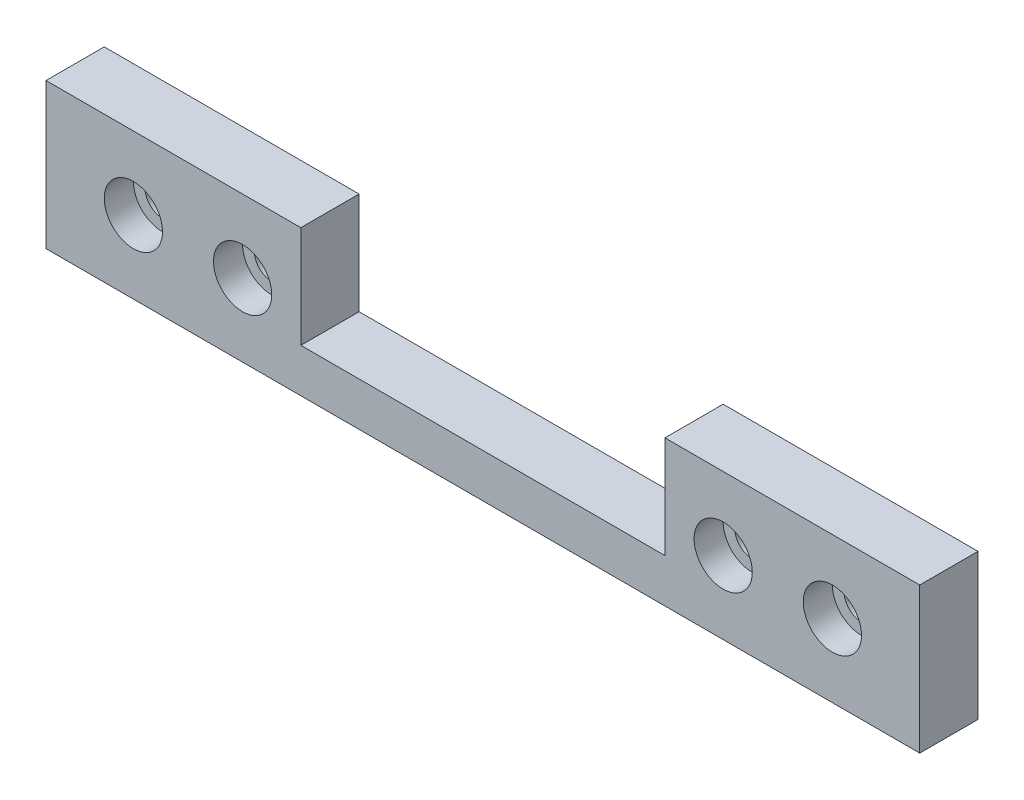
ISO-10303-21;
HEADER;
FILE_DESCRIPTION(('STEP AP214'),'2;1');
FILE_NAME('part.step','',(''),(''),'','','');
FILE_SCHEMA(('AUTOMOTIVE_DESIGN { 1 0 10303 214 1 1 1 1 }'));
ENDSEC;
DATA;
#1=APPLICATION_CONTEXT('core data for automotive mechanical design processes');
#2=APPLICATION_PROTOCOL_DEFINITION('international standard','automotive_design',2000,#1);
#3=PRODUCT_CONTEXT('',#1,'mechanical');
#4=PRODUCT('Part','Part','',(#3));
#5=PRODUCT_RELATED_PRODUCT_CATEGORY('part','',(#4));
#6=PRODUCT_DEFINITION_FORMATION('','',#4);
#7=PRODUCT_DEFINITION_CONTEXT('part definition',#1,'design');
#8=PRODUCT_DEFINITION('design','',#6,#7);
#9=PRODUCT_DEFINITION_SHAPE('','',#8);
#10=(LENGTH_UNIT() NAMED_UNIT(*) SI_UNIT(.MILLI.,.METRE.));
#11=(NAMED_UNIT(*) PLANE_ANGLE_UNIT() SI_UNIT($,.RADIAN.));
#12=(NAMED_UNIT(*) SI_UNIT($,.STERADIAN.) SOLID_ANGLE_UNIT());
#13=UNCERTAINTY_MEASURE_WITH_UNIT(LENGTH_MEASURE(1.E-05),#10,'distance_accuracy_value','');
#14=(GEOMETRIC_REPRESENTATION_CONTEXT(3) GLOBAL_UNCERTAINTY_ASSIGNED_CONTEXT((#13)) GLOBAL_UNIT_ASSIGNED_CONTEXT((#10,
#11,#12)) REPRESENTATION_CONTEXT('',''));
#15=CARTESIAN_POINT('',(0.,0.,0.));
#16=DIRECTION('',(0.,0.,1.));
#17=DIRECTION('',(1.,0.,0.));
#18=AXIS2_PLACEMENT_3D('',#15,#16,#17);
#19=CARTESIAN_POINT('',(0.,20.,8.));
#20=DIRECTION('',(0.,-1.,0.));
#21=DIRECTION('',(0.,0.,-1.));
#22=AXIS2_PLACEMENT_3D('',#19,#20,#21);
#23=PLANE('',#22);
#24=DIRECTION('',(-1.,0.,0.));
#25=VECTOR('',#24,1.);
#26=CARTESIAN_POINT('',(0.,20.,0.));
#27=LINE('',#26,#25);
#28=CARTESIAN_POINT('',(120.,20.,0.));
#29=VERTEX_POINT('',#28);
#30=CARTESIAN_POINT('',(85.,20.,0.));
#31=VERTEX_POINT('',#30);
#32=EDGE_CURVE('E125',#29,#31,#27,.T.);
#33=ORIENTED_EDGE('',*,*,#32,.T.);
#34=DIRECTION('',(0.,0.,1.));
#35=VECTOR('',#34,1.);
#36=CARTESIAN_POINT('',(85.,20.,0.));
#37=LINE('',#36,#35);
#38=CARTESIAN_POINT('',(85.,20.,8.));
#39=VERTEX_POINT('',#38);
#40=EDGE_CURVE('E109',#31,#39,#37,.T.);
#41=ORIENTED_EDGE('',*,*,#40,.T.);
#42=DIRECTION('',(-1.,0.,0.));
#43=VECTOR('',#42,1.);
#44=CARTESIAN_POINT('',(0.,20.,8.));
#45=LINE('',#44,#43);
#46=CARTESIAN_POINT('',(120.,20.,8.));
#47=VERTEX_POINT('',#46);
#48=EDGE_CURVE('E142',#47,#39,#45,.T.);
#49=ORIENTED_EDGE('',*,*,#48,.F.);
#50=DIRECTION('',(0.,0.,-1.));
#51=VECTOR('',#50,1.);
#52=CARTESIAN_POINT('',(120.,20.,8.));
#53=LINE('',#52,#51);
#54=EDGE_CURVE('E132',#47,#29,#53,.T.);
#55=ORIENTED_EDGE('',*,*,#54,.T.);
#56=EDGE_LOOP('',(#33,#41,#49,#55));
#57=FACE_BOUND('',#56,.T.);
#58=ADVANCED_FACE('F34',(#57),#23,.F.);
#59=CARTESIAN_POINT('',(0.,0.,8.));
#60=DIRECTION('',(1.,0.,0.));
#61=DIRECTION('',(0.,0.,-1.));
#62=AXIS2_PLACEMENT_3D('',#59,#60,#61);
#63=PLANE('',#62);
#64=DIRECTION('',(0.,-1.,0.));
#65=VECTOR('',#64,1.);
#66=CARTESIAN_POINT('',(0.,0.,0.));
#67=LINE('',#66,#65);
#68=CARTESIAN_POINT('',(0.,20.,0.));
#69=VERTEX_POINT('',#68);
#70=CARTESIAN_POINT('',(0.,0.,0.));
#71=VERTEX_POINT('',#70);
#72=EDGE_CURVE('E150',#69,#71,#67,.T.);
#73=ORIENTED_EDGE('',*,*,#72,.T.);
#74=DIRECTION('',(0.,0.,-1.));
#75=VECTOR('',#74,1.);
#76=CARTESIAN_POINT('',(0.,0.,8.));
#77=LINE('',#76,#75);
#78=CARTESIAN_POINT('',(0.,0.,8.));
#79=VERTEX_POINT('',#78);
#80=EDGE_CURVE('E11',#79,#71,#77,.T.);
#81=ORIENTED_EDGE('',*,*,#80,.F.);
#82=DIRECTION('',(0.,-1.,0.));
#83=VECTOR('',#82,1.);
#84=CARTESIAN_POINT('',(0.,0.,8.));
#85=LINE('',#84,#83);
#86=CARTESIAN_POINT('',(0.,20.,8.));
#87=VERTEX_POINT('',#86);
#88=EDGE_CURVE('E133',#87,#79,#85,.T.);
#89=ORIENTED_EDGE('',*,*,#88,.F.);
#90=DIRECTION('',(0.,0.,-1.));
#91=VECTOR('',#90,1.);
#92=CARTESIAN_POINT('',(0.,20.,8.));
#93=LINE('',#92,#91);
#94=EDGE_CURVE('E140',#87,#69,#93,.T.);
#95=ORIENTED_EDGE('',*,*,#94,.T.);
#96=EDGE_LOOP('',(#73,#81,#89,#95));
#97=FACE_BOUND('',#96,.T.);
#98=ADVANCED_FACE('F36',(#97),#63,.F.);
#99=CARTESIAN_POINT('',(0.,0.,8.));
#100=DIRECTION('',(0.,1.,0.));
#101=DIRECTION('',(0.,0.,1.));
#102=AXIS2_PLACEMENT_3D('',#99,#100,#101);
#103=PLANE('',#102);
#104=DIRECTION('',(1.,0.,0.));
#105=VECTOR('',#104,1.);
#106=CARTESIAN_POINT('',(0.,0.,0.));
#107=LINE('',#106,#105);
#108=CARTESIAN_POINT('',(120.,0.,0.));
#109=VERTEX_POINT('',#108);
#110=EDGE_CURVE('E149',#71,#109,#107,.T.);
#111=ORIENTED_EDGE('',*,*,#110,.T.);
#112=DIRECTION('',(0.,0.,-1.));
#113=VECTOR('',#112,1.);
#114=CARTESIAN_POINT('',(120.,0.,8.));
#115=LINE('',#114,#113);
#116=CARTESIAN_POINT('',(120.,0.,8.));
#117=VERTEX_POINT('',#116);
#118=EDGE_CURVE('E42',#117,#109,#115,.T.);
#119=ORIENTED_EDGE('',*,*,#118,.F.);
#120=DIRECTION('',(1.,0.,0.));
#121=VECTOR('',#120,1.);
#122=CARTESIAN_POINT('',(0.,0.,8.));
#123=LINE('',#122,#121);
#124=EDGE_CURVE('E87',#79,#117,#123,.T.);
#125=ORIENTED_EDGE('',*,*,#124,.F.);
#126=ORIENTED_EDGE('',*,*,#80,.T.);
#127=EDGE_LOOP('',(#111,#119,#125,#126));
#128=FACE_BOUND('',#127,.T.);
#129=ADVANCED_FACE('F235',(#128),#103,.F.);
#130=CARTESIAN_POINT('',(120.,0.,8.));
#131=DIRECTION('',(-1.,0.,0.));
#132=DIRECTION('',(0.,0.,1.));
#133=AXIS2_PLACEMENT_3D('',#130,#131,#132);
#134=PLANE('',#133);
#135=DIRECTION('',(0.,1.,0.));
#136=VECTOR('',#135,1.);
#137=CARTESIAN_POINT('',(120.,0.,0.));
#138=LINE('',#137,#136);
#139=EDGE_CURVE('E136',#109,#29,#138,.T.);
#140=ORIENTED_EDGE('',*,*,#139,.T.);
#141=ORIENTED_EDGE('',*,*,#54,.F.);
#142=DIRECTION('',(0.,1.,0.));
#143=VECTOR('',#142,1.);
#144=CARTESIAN_POINT('',(120.,0.,8.));
#145=LINE('',#144,#143);
#146=EDGE_CURVE('E147',#117,#47,#145,.T.);
#147=ORIENTED_EDGE('',*,*,#146,.F.);
#148=ORIENTED_EDGE('',*,*,#118,.T.);
#149=EDGE_LOOP('',(#140,#141,#147,#148));
#150=FACE_BOUND('',#149,.T.);
#151=ADVANCED_FACE('F146',(#150),#134,.F.);
#152=CARTESIAN_POINT('',(35.,20.,8.));
#153=VERTEX_POINT('',#152);
#154=EDGE_CURVE('E58',#153,#87,#45,.T.);
#155=ORIENTED_EDGE('',*,*,#154,.F.);
#156=DIRECTION('',(0.,0.,1.));
#157=VECTOR('',#156,1.);
#158=CARTESIAN_POINT('',(35.,20.,0.));
#159=LINE('',#158,#157);
#160=CARTESIAN_POINT('',(35.,20.,0.));
#161=VERTEX_POINT('',#160);
#162=EDGE_CURVE('E119',#161,#153,#159,.T.);
#163=ORIENTED_EDGE('',*,*,#162,.F.);
#164=EDGE_CURVE('E80',#161,#69,#27,.T.);
#165=ORIENTED_EDGE('',*,*,#164,.T.);
#166=ORIENTED_EDGE('',*,*,#94,.F.);
#167=EDGE_LOOP('',(#155,#163,#165,#166));
#168=FACE_BOUND('',#167,.T.);
#169=ADVANCED_FACE('F224',(#168),#23,.F.);
#170=CARTESIAN_POINT('',(0.,20.,8.));
#171=DIRECTION('',(0.,0.,-1.));
#172=DIRECTION('',(-1.,0.,0.));
#173=AXIS2_PLACEMENT_3D('',#170,#171,#172);
#174=PLANE('',#173);
#175=CARTESIAN_POINT('',(12.,10.,8.));
#176=DIRECTION('',(0.,0.,1.));
#177=DIRECTION('',(1.,0.,0.));
#178=AXIS2_PLACEMENT_3D('',#175,#176,#177);
#179=CIRCLE('',#178,3.99999999999999);
#180=CARTESIAN_POINT('',(16.,10.,8.));
#181=VERTEX_POINT('',#180);
#182=EDGE_CURVE('E215',#181,#181,#179,.T.);
#183=ORIENTED_EDGE('',*,*,#182,.F.);
#184=EDGE_LOOP('',(#183));
#185=FACE_BOUND('',#184,.T.);
#186=CARTESIAN_POINT('',(27.,10.,8.));
#187=DIRECTION('',(0.,0.,1.));
#188=DIRECTION('',(1.,0.,0.));
#189=AXIS2_PLACEMENT_3D('',#186,#187,#188);
#190=CIRCLE('',#189,3.99999999999999);
#191=CARTESIAN_POINT('',(31.,10.,8.));
#192=VERTEX_POINT('',#191);
#193=EDGE_CURVE('E203',#192,#192,#190,.T.);
#194=ORIENTED_EDGE('',*,*,#193,.F.);
#195=EDGE_LOOP('',(#194));
#196=FACE_BOUND('',#195,.T.);
#197=CARTESIAN_POINT('',(93.,10.,8.));
#198=DIRECTION('',(0.,0.,1.));
#199=DIRECTION('',(1.,0.,0.));
#200=AXIS2_PLACEMENT_3D('',#197,#198,#199);
#201=CIRCLE('',#200,3.99999999999999);
#202=CARTESIAN_POINT('',(97.,10.,8.));
#203=VERTEX_POINT('',#202);
#204=EDGE_CURVE('E191',#203,#203,#201,.T.);
#205=ORIENTED_EDGE('',*,*,#204,.F.);
#206=EDGE_LOOP('',(#205));
#207=FACE_BOUND('',#206,.T.);
#208=CARTESIAN_POINT('',(108.,10.,8.));
#209=DIRECTION('',(0.,0.,1.));
#210=DIRECTION('',(1.,0.,0.));
#211=AXIS2_PLACEMENT_3D('',#208,#209,#210);
#212=CIRCLE('',#211,3.99999999999999);
#213=CARTESIAN_POINT('',(112.,10.,8.));
#214=VERTEX_POINT('',#213);
#215=EDGE_CURVE('E179',#214,#214,#212,.T.);
#216=ORIENTED_EDGE('',*,*,#215,.F.);
#217=EDGE_LOOP('',(#216));
#218=FACE_BOUND('',#217,.T.);
#219=ORIENTED_EDGE('',*,*,#48,.T.);
#220=DIRECTION('',(0.,1.,0.));
#221=VECTOR('',#220,1.);
#222=CARTESIAN_POINT('',(85.,20.,8.));
#223=LINE('',#222,#221);
#224=CARTESIAN_POINT('',(85.,6.00000000000002,8.));
#225=VERTEX_POINT('',#224);
#226=EDGE_CURVE('E114',#225,#39,#223,.T.);
#227=ORIENTED_EDGE('',*,*,#226,.F.);
#228=DIRECTION('',(1.,0.,0.));
#229=VECTOR('',#228,1.);
#230=CARTESIAN_POINT('',(85.,6.00000000000002,8.));
#231=LINE('',#230,#229);
#232=CARTESIAN_POINT('',(35.,6.00000000000001,8.));
#233=VERTEX_POINT('',#232);
#234=EDGE_CURVE('E128',#233,#225,#231,.T.);
#235=ORIENTED_EDGE('',*,*,#234,.F.);
#236=DIRECTION('',(0.,-1.,0.));
#237=VECTOR('',#236,1.);
#238=CARTESIAN_POINT('',(35.,20.,8.));
#239=LINE('',#238,#237);
#240=EDGE_CURVE('E164',#153,#233,#239,.T.);
#241=ORIENTED_EDGE('',*,*,#240,.F.);
#242=ORIENTED_EDGE('',*,*,#154,.T.);
#243=ORIENTED_EDGE('',*,*,#88,.T.);
#244=ORIENTED_EDGE('',*,*,#124,.T.);
#245=ORIENTED_EDGE('',*,*,#146,.T.);
#246=EDGE_LOOP('',(#219,#227,#235,#241,#242,#243,#244,#245));
#247=FACE_BOUND('',#246,.T.);
#248=ADVANCED_FACE('F221',(#185,#196,#207,#218,#247),#174,.F.);
#249=CARTESIAN_POINT('',(0.,20.,0.));
#250=DIRECTION('',(0.,0.,-1.));
#251=DIRECTION('',(-1.,0.,0.));
#252=AXIS2_PLACEMENT_3D('',#249,#250,#251);
#253=PLANE('',#252);
#254=CARTESIAN_POINT('',(12.,10.,0.));
#255=DIRECTION('',(0.,0.,1.));
#256=DIRECTION('',(1.,0.,0.));
#257=AXIS2_PLACEMENT_3D('',#254,#255,#256);
#258=CIRCLE('',#257,2.4);
#259=CARTESIAN_POINT('',(14.4,10.,0.));
#260=VERTEX_POINT('',#259);
#261=EDGE_CURVE('E206',#260,#260,#258,.T.);
#262=ORIENTED_EDGE('',*,*,#261,.T.);
#263=EDGE_LOOP('',(#262));
#264=FACE_BOUND('',#263,.T.);
#265=CARTESIAN_POINT('',(27.,10.,0.));
#266=DIRECTION('',(0.,0.,1.));
#267=DIRECTION('',(1.,0.,0.));
#268=AXIS2_PLACEMENT_3D('',#265,#266,#267);
#269=CIRCLE('',#268,2.4);
#270=CARTESIAN_POINT('',(29.4,10.,0.));
#271=VERTEX_POINT('',#270);
#272=EDGE_CURVE('E194',#271,#271,#269,.T.);
#273=ORIENTED_EDGE('',*,*,#272,.T.);
#274=EDGE_LOOP('',(#273));
#275=FACE_BOUND('',#274,.T.);
#276=CARTESIAN_POINT('',(93.,10.,0.));
#277=DIRECTION('',(0.,0.,1.));
#278=DIRECTION('',(1.,0.,0.));
#279=AXIS2_PLACEMENT_3D('',#276,#277,#278);
#280=CIRCLE('',#279,2.4);
#281=CARTESIAN_POINT('',(95.4,10.,0.));
#282=VERTEX_POINT('',#281);
#283=EDGE_CURVE('E182',#282,#282,#280,.T.);
#284=ORIENTED_EDGE('',*,*,#283,.T.);
#285=EDGE_LOOP('',(#284));
#286=FACE_BOUND('',#285,.T.);
#287=CARTESIAN_POINT('',(108.,10.,0.));
#288=DIRECTION('',(0.,0.,1.));
#289=DIRECTION('',(1.,0.,0.));
#290=AXIS2_PLACEMENT_3D('',#287,#288,#289);
#291=CIRCLE('',#290,2.4);
#292=CARTESIAN_POINT('',(110.4,10.,0.));
#293=VERTEX_POINT('',#292);
#294=EDGE_CURVE('E168',#293,#293,#291,.T.);
#295=ORIENTED_EDGE('',*,*,#294,.T.);
#296=EDGE_LOOP('',(#295));
#297=FACE_BOUND('',#296,.T.);
#298=DIRECTION('',(0.,1.,0.));
#299=VECTOR('',#298,1.);
#300=CARTESIAN_POINT('',(85.,20.,0.));
#301=LINE('',#300,#299);
#302=CARTESIAN_POINT('',(85.,6.00000000000002,0.));
#303=VERTEX_POINT('',#302);
#304=EDGE_CURVE('E112',#303,#31,#301,.T.);
#305=ORIENTED_EDGE('',*,*,#304,.T.);
#306=ORIENTED_EDGE('',*,*,#32,.F.);
#307=ORIENTED_EDGE('',*,*,#139,.F.);
#308=ORIENTED_EDGE('',*,*,#110,.F.);
#309=ORIENTED_EDGE('',*,*,#72,.F.);
#310=ORIENTED_EDGE('',*,*,#164,.F.);
#311=DIRECTION('',(0.,-1.,0.));
#312=VECTOR('',#311,1.);
#313=CARTESIAN_POINT('',(35.,20.,0.));
#314=LINE('',#313,#312);
#315=CARTESIAN_POINT('',(35.,6.00000000000001,0.));
#316=VERTEX_POINT('',#315);
#317=EDGE_CURVE('E127',#161,#316,#314,.T.);
#318=ORIENTED_EDGE('',*,*,#317,.T.);
#319=DIRECTION('',(1.,0.,0.));
#320=VECTOR('',#319,1.);
#321=CARTESIAN_POINT('',(85.,6.00000000000002,0.));
#322=LINE('',#321,#320);
#323=EDGE_CURVE('E49',#316,#303,#322,.T.);
#324=ORIENTED_EDGE('',*,*,#323,.T.);
#325=EDGE_LOOP('',(#305,#306,#307,#308,#309,#310,#318,#324));
#326=FACE_BOUND('',#325,.T.);
#327=ADVANCED_FACE('F123',(#264,#275,#286,#297,#326),#253,.T.);
#328=CARTESIAN_POINT('',(85.,20.,0.));
#329=DIRECTION('',(1.,0.,0.));
#330=DIRECTION('',(0.,1.,0.));
#331=AXIS2_PLACEMENT_3D('',#328,#329,#330);
#332=PLANE('',#331);
#333=ORIENTED_EDGE('',*,*,#226,.T.);
#334=ORIENTED_EDGE('',*,*,#40,.F.);
#335=ORIENTED_EDGE('',*,*,#304,.F.);
#336=DIRECTION('',(0.,0.,1.));
#337=VECTOR('',#336,1.);
#338=CARTESIAN_POINT('',(85.,6.00000000000002,0.));
#339=LINE('',#338,#337);
#340=EDGE_CURVE('E152',#303,#225,#339,.T.);
#341=ORIENTED_EDGE('',*,*,#340,.T.);
#342=EDGE_LOOP('',(#333,#334,#335,#341));
#343=FACE_BOUND('',#342,.T.);
#344=ADVANCED_FACE('F111',(#343),#332,.F.);
#345=CARTESIAN_POINT('',(85.,6.00000000000002,0.));
#346=DIRECTION('',(0.,-1.,0.));
#347=DIRECTION('',(1.,0.,0.));
#348=AXIS2_PLACEMENT_3D('',#345,#346,#347);
#349=PLANE('',#348);
#350=ORIENTED_EDGE('',*,*,#234,.T.);
#351=ORIENTED_EDGE('',*,*,#340,.F.);
#352=ORIENTED_EDGE('',*,*,#323,.F.);
#353=DIRECTION('',(0.,0.,1.));
#354=VECTOR('',#353,1.);
#355=CARTESIAN_POINT('',(35.,6.00000000000001,0.));
#356=LINE('',#355,#354);
#357=EDGE_CURVE('E159',#316,#233,#356,.T.);
#358=ORIENTED_EDGE('',*,*,#357,.T.);
#359=EDGE_LOOP('',(#350,#351,#352,#358));
#360=FACE_BOUND('',#359,.T.);
#361=ADVANCED_FACE('F252',(#360),#349,.F.);
#362=CARTESIAN_POINT('',(35.,20.,0.));
#363=DIRECTION('',(-1.,0.,0.));
#364=DIRECTION('',(0.,0.,1.));
#365=AXIS2_PLACEMENT_3D('',#362,#363,#364);
#366=PLANE('',#365);
#367=ORIENTED_EDGE('',*,*,#240,.T.);
#368=ORIENTED_EDGE('',*,*,#357,.F.);
#369=ORIENTED_EDGE('',*,*,#317,.F.);
#370=ORIENTED_EDGE('',*,*,#162,.T.);
#371=EDGE_LOOP('',(#367,#368,#369,#370));
#372=FACE_BOUND('',#371,.T.);
#373=ADVANCED_FACE('F251',(#372),#366,.F.);
#374=CARTESIAN_POINT('',(108.,10.,8.));
#375=DIRECTION('',(0.,0.,1.));
#376=DIRECTION('',(1.,0.,0.));
#377=AXIS2_PLACEMENT_3D('',#374,#375,#376);
#378=CYLINDRICAL_SURFACE('',#377,2.4);
#379=ORIENTED_EDGE('',*,*,#294,.F.);
#380=EDGE_LOOP('',(#379));
#381=FACE_BOUND('',#380,.T.);
#382=CARTESIAN_POINT('',(108.,10.,4.));
#383=DIRECTION('',(0.,0.,1.));
#384=DIRECTION('',(1.,0.,0.));
#385=AXIS2_PLACEMENT_3D('',#382,#383,#384);
#386=CIRCLE('',#385,2.4);
#387=CARTESIAN_POINT('',(110.4,10.,4.));
#388=VERTEX_POINT('',#387);
#389=EDGE_CURVE('E173',#388,#388,#386,.T.);
#390=ORIENTED_EDGE('',*,*,#389,.T.);
#391=EDGE_LOOP('',(#390));
#392=FACE_BOUND('',#391,.T.);
#393=ADVANCED_FACE('F259',(#381,#392),#378,.F.);
#394=CARTESIAN_POINT('',(110.4,10.,4.));
#395=DIRECTION('',(0.,0.,-1.));
#396=DIRECTION('',(-1.,0.,0.));
#397=AXIS2_PLACEMENT_3D('',#394,#395,#396);
#398=PLANE('',#397);
#399=ORIENTED_EDGE('',*,*,#389,.F.);
#400=EDGE_LOOP('',(#399));
#401=FACE_BOUND('',#400,.T.);
#402=CARTESIAN_POINT('',(108.,10.,4.));
#403=DIRECTION('',(0.,0.,1.));
#404=DIRECTION('',(1.,0.,0.));
#405=AXIS2_PLACEMENT_3D('',#402,#403,#404);
#406=CIRCLE('',#405,4.);
#407=CARTESIAN_POINT('',(112.,10.,4.));
#408=VERTEX_POINT('',#407);
#409=EDGE_CURVE('E176',#408,#408,#406,.T.);
#410=ORIENTED_EDGE('',*,*,#409,.T.);
#411=EDGE_LOOP('',(#410));
#412=FACE_BOUND('',#411,.T.);
#413=ADVANCED_FACE('F278',(#401,#412),#398,.F.);
#414=CARTESIAN_POINT('',(108.,10.,8.));
#415=DIRECTION('',(0.,0.,1.));
#416=DIRECTION('',(1.,0.,0.));
#417=AXIS2_PLACEMENT_3D('',#414,#415,#416);
#418=CYLINDRICAL_SURFACE('',#417,4.);
#419=ORIENTED_EDGE('',*,*,#409,.F.);
#420=EDGE_LOOP('',(#419));
#421=FACE_BOUND('',#420,.T.);
#422=ORIENTED_EDGE('',*,*,#215,.T.);
#423=EDGE_LOOP('',(#422));
#424=FACE_BOUND('',#423,.T.);
#425=ADVANCED_FACE('F283',(#421,#424),#418,.F.);
#426=CARTESIAN_POINT('',(93.,10.,8.));
#427=DIRECTION('',(0.,0.,1.));
#428=DIRECTION('',(1.,0.,0.));
#429=AXIS2_PLACEMENT_3D('',#426,#427,#428);
#430=CYLINDRICAL_SURFACE('',#429,2.4);
#431=ORIENTED_EDGE('',*,*,#283,.F.);
#432=EDGE_LOOP('',(#431));
#433=FACE_BOUND('',#432,.T.);
#434=CARTESIAN_POINT('',(93.,10.,4.));
#435=DIRECTION('',(0.,0.,1.));
#436=DIRECTION('',(1.,0.,0.));
#437=AXIS2_PLACEMENT_3D('',#434,#435,#436);
#438=CIRCLE('',#437,2.4);
#439=CARTESIAN_POINT('',(95.4,10.,4.));
#440=VERTEX_POINT('',#439);
#441=EDGE_CURVE('E185',#440,#440,#438,.T.);
#442=ORIENTED_EDGE('',*,*,#441,.T.);
#443=EDGE_LOOP('',(#442));
#444=FACE_BOUND('',#443,.T.);
#445=ADVANCED_FACE('F288',(#433,#444),#430,.F.);
#446=CARTESIAN_POINT('',(95.4,10.,4.));
#447=DIRECTION('',(0.,0.,-1.));
#448=DIRECTION('',(-1.,0.,0.));
#449=AXIS2_PLACEMENT_3D('',#446,#447,#448);
#450=PLANE('',#449);
#451=ORIENTED_EDGE('',*,*,#441,.F.);
#452=EDGE_LOOP('',(#451));
#453=FACE_BOUND('',#452,.T.);
#454=CARTESIAN_POINT('',(93.,10.,4.));
#455=DIRECTION('',(0.,0.,1.));
#456=DIRECTION('',(1.,0.,0.));
#457=AXIS2_PLACEMENT_3D('',#454,#455,#456);
#458=CIRCLE('',#457,4.);
#459=CARTESIAN_POINT('',(97.,10.,4.));
#460=VERTEX_POINT('',#459);
#461=EDGE_CURVE('E188',#460,#460,#458,.T.);
#462=ORIENTED_EDGE('',*,*,#461,.T.);
#463=EDGE_LOOP('',(#462));
#464=FACE_BOUND('',#463,.T.);
#465=ADVANCED_FACE('F293',(#453,#464),#450,.F.);
#466=CARTESIAN_POINT('',(93.,10.,8.));
#467=DIRECTION('',(0.,0.,1.));
#468=DIRECTION('',(1.,0.,0.));
#469=AXIS2_PLACEMENT_3D('',#466,#467,#468);
#470=CYLINDRICAL_SURFACE('',#469,4.);
#471=ORIENTED_EDGE('',*,*,#461,.F.);
#472=EDGE_LOOP('',(#471));
#473=FACE_BOUND('',#472,.T.);
#474=ORIENTED_EDGE('',*,*,#204,.T.);
#475=EDGE_LOOP('',(#474));
#476=FACE_BOUND('',#475,.T.);
#477=ADVANCED_FACE('F299',(#473,#476),#470,.F.);
#478=CARTESIAN_POINT('',(27.,10.,8.));
#479=DIRECTION('',(0.,0.,1.));
#480=DIRECTION('',(1.,0.,0.));
#481=AXIS2_PLACEMENT_3D('',#478,#479,#480);
#482=CYLINDRICAL_SURFACE('',#481,2.4);
#483=ORIENTED_EDGE('',*,*,#272,.F.);
#484=EDGE_LOOP('',(#483));
#485=FACE_BOUND('',#484,.T.);
#486=CARTESIAN_POINT('',(27.,10.,4.));
#487=DIRECTION('',(0.,0.,1.));
#488=DIRECTION('',(1.,0.,0.));
#489=AXIS2_PLACEMENT_3D('',#486,#487,#488);
#490=CIRCLE('',#489,2.4);
#491=CARTESIAN_POINT('',(29.4,10.,4.));
#492=VERTEX_POINT('',#491);
#493=EDGE_CURVE('E197',#492,#492,#490,.T.);
#494=ORIENTED_EDGE('',*,*,#493,.T.);
#495=EDGE_LOOP('',(#494));
#496=FACE_BOUND('',#495,.T.);
#497=ADVANCED_FACE('F303',(#485,#496),#482,.F.);
#498=CARTESIAN_POINT('',(29.4,10.,4.));
#499=DIRECTION('',(0.,0.,-1.));
#500=DIRECTION('',(-1.,0.,0.));
#501=AXIS2_PLACEMENT_3D('',#498,#499,#500);
#502=PLANE('',#501);
#503=ORIENTED_EDGE('',*,*,#493,.F.);
#504=EDGE_LOOP('',(#503));
#505=FACE_BOUND('',#504,.T.);
#506=CARTESIAN_POINT('',(27.,10.,4.));
#507=DIRECTION('',(0.,0.,1.));
#508=DIRECTION('',(1.,0.,0.));
#509=AXIS2_PLACEMENT_3D('',#506,#507,#508);
#510=CIRCLE('',#509,4.);
#511=CARTESIAN_POINT('',(31.,10.,4.));
#512=VERTEX_POINT('',#511);
#513=EDGE_CURVE('E200',#512,#512,#510,.T.);
#514=ORIENTED_EDGE('',*,*,#513,.T.);
#515=EDGE_LOOP('',(#514));
#516=FACE_BOUND('',#515,.T.);
#517=ADVANCED_FACE('F307',(#505,#516),#502,.F.);
#518=CARTESIAN_POINT('',(27.,10.,8.));
#519=DIRECTION('',(0.,0.,1.));
#520=DIRECTION('',(1.,0.,0.));
#521=AXIS2_PLACEMENT_3D('',#518,#519,#520);
#522=CYLINDRICAL_SURFACE('',#521,3.99999999999999);
#523=ORIENTED_EDGE('',*,*,#513,.F.);
#524=EDGE_LOOP('',(#523));
#525=FACE_BOUND('',#524,.T.);
#526=ORIENTED_EDGE('',*,*,#193,.T.);
#527=EDGE_LOOP('',(#526));
#528=FACE_BOUND('',#527,.T.);
#529=ADVANCED_FACE('F311',(#525,#528),#522,.F.);
#530=CARTESIAN_POINT('',(12.,10.,8.));
#531=DIRECTION('',(0.,0.,1.));
#532=DIRECTION('',(1.,0.,0.));
#533=AXIS2_PLACEMENT_3D('',#530,#531,#532);
#534=CYLINDRICAL_SURFACE('',#533,2.4);
#535=ORIENTED_EDGE('',*,*,#261,.F.);
#536=EDGE_LOOP('',(#535));
#537=FACE_BOUND('',#536,.T.);
#538=CARTESIAN_POINT('',(12.,10.,4.));
#539=DIRECTION('',(0.,0.,1.));
#540=DIRECTION('',(1.,0.,0.));
#541=AXIS2_PLACEMENT_3D('',#538,#539,#540);
#542=CIRCLE('',#541,2.4);
#543=CARTESIAN_POINT('',(14.4,10.,4.));
#544=VERTEX_POINT('',#543);
#545=EDGE_CURVE('E209',#544,#544,#542,.T.);
#546=ORIENTED_EDGE('',*,*,#545,.T.);
#547=EDGE_LOOP('',(#546));
#548=FACE_BOUND('',#547,.T.);
#549=ADVANCED_FACE('F315',(#537,#548),#534,.F.);
#550=CARTESIAN_POINT('',(14.4,10.,4.));
#551=DIRECTION('',(0.,0.,-1.));
#552=DIRECTION('',(-1.,0.,0.));
#553=AXIS2_PLACEMENT_3D('',#550,#551,#552);
#554=PLANE('',#553);
#555=ORIENTED_EDGE('',*,*,#545,.F.);
#556=EDGE_LOOP('',(#555));
#557=FACE_BOUND('',#556,.T.);
#558=CARTESIAN_POINT('',(12.,10.,4.));
#559=DIRECTION('',(0.,0.,1.));
#560=DIRECTION('',(1.,0.,0.));
#561=AXIS2_PLACEMENT_3D('',#558,#559,#560);
#562=CIRCLE('',#561,4.);
#563=CARTESIAN_POINT('',(16.,10.,4.));
#564=VERTEX_POINT('',#563);
#565=EDGE_CURVE('E212',#564,#564,#562,.T.);
#566=ORIENTED_EDGE('',*,*,#565,.T.);
#567=EDGE_LOOP('',(#566));
#568=FACE_BOUND('',#567,.T.);
#569=ADVANCED_FACE('F319',(#557,#568),#554,.F.);
#570=CARTESIAN_POINT('',(12.,10.,8.));
#571=DIRECTION('',(0.,0.,1.));
#572=DIRECTION('',(1.,0.,0.));
#573=AXIS2_PLACEMENT_3D('',#570,#571,#572);
#574=CYLINDRICAL_SURFACE('',#573,3.99999999999999);
#575=ORIENTED_EDGE('',*,*,#565,.F.);
#576=EDGE_LOOP('',(#575));
#577=FACE_BOUND('',#576,.T.);
#578=ORIENTED_EDGE('',*,*,#182,.T.);
#579=EDGE_LOOP('',(#578));
#580=FACE_BOUND('',#579,.T.);
#581=ADVANCED_FACE('F219',(#577,#580),#574,.F.);
#582=CLOSED_SHELL('',(#58,#98,#129,#151,#169,#248,#327,#344,#361,#373,#393,#413,#425,#445,#465,
#477,#497,#517,#529,#549,#569,#581));
#583=MANIFOLD_SOLID_BREP('B2',#582);
#584=ADVANCED_BREP_SHAPE_REPRESENTATION('',(#18,#583),#14);
#585=SHAPE_DEFINITION_REPRESENTATION(#9,#584);
ENDSEC;
END-ISO-10303-21;
